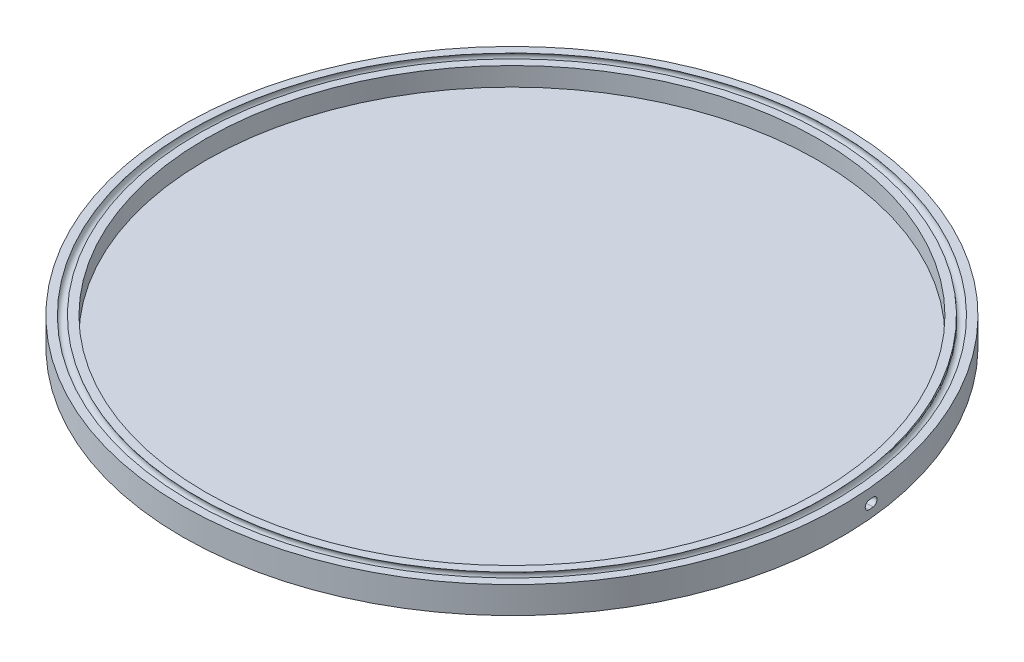
ISO-10303-21;
HEADER;
FILE_DESCRIPTION(('STEP AP214'),'2;1');
FILE_NAME('part.step','',(''),(''),'','','');
FILE_SCHEMA(('AUTOMOTIVE_DESIGN { 1 0 10303 214 1 1 1 1 }'));
ENDSEC;
DATA;
#1=APPLICATION_CONTEXT('core data for automotive mechanical design processes');
#2=APPLICATION_PROTOCOL_DEFINITION('international standard','automotive_design',2000,#1);
#3=PRODUCT_CONTEXT('',#1,'mechanical');
#4=PRODUCT('Part','Part','',(#3));
#5=PRODUCT_RELATED_PRODUCT_CATEGORY('part','',(#4));
#6=PRODUCT_DEFINITION_FORMATION('','',#4);
#7=PRODUCT_DEFINITION_CONTEXT('part definition',#1,'design');
#8=PRODUCT_DEFINITION('design','',#6,#7);
#9=PRODUCT_DEFINITION_SHAPE('','',#8);
#10=(LENGTH_UNIT() NAMED_UNIT(*) SI_UNIT(.MILLI.,.METRE.));
#11=(NAMED_UNIT(*) PLANE_ANGLE_UNIT() SI_UNIT($,.RADIAN.));
#12=(NAMED_UNIT(*) SI_UNIT($,.STERADIAN.) SOLID_ANGLE_UNIT());
#13=UNCERTAINTY_MEASURE_WITH_UNIT(LENGTH_MEASURE(1.E-05),#10,'distance_accuracy_value','');
#14=(GEOMETRIC_REPRESENTATION_CONTEXT(3) GLOBAL_UNCERTAINTY_ASSIGNED_CONTEXT((#13)) GLOBAL_UNIT_ASSIGNED_CONTEXT((#10,
#11,#12)) REPRESENTATION_CONTEXT('',''));
#15=CARTESIAN_POINT('',(0.,0.,0.));
#16=DIRECTION('',(0.,0.,1.));
#17=DIRECTION('',(1.,0.,0.));
#18=AXIS2_PLACEMENT_3D('',#15,#16,#17);
#19=CARTESIAN_POINT('',(0.,3.5,0.));
#20=DIRECTION('',(0.,-1.,0.));
#21=DIRECTION('',(0.,0.,-1.));
#22=AXIS2_PLACEMENT_3D('',#19,#20,#21);
#23=CYLINDRICAL_SURFACE('',#22,141.);
#24=CARTESIAN_POINT('',(0.,11.5,0.));
#25=DIRECTION('',(0.,1.,0.));
#26=DIRECTION('',(0.,0.,1.));
#27=AXIS2_PLACEMENT_3D('',#24,#25,#26);
#28=CIRCLE('',#27,141.);
#29=CARTESIAN_POINT('',(0.,11.5,141.));
#30=VERTEX_POINT('',#29);
#31=EDGE_CURVE('E154',#30,#30,#28,.T.);
#32=ORIENTED_EDGE('',*,*,#31,.F.);
#33=EDGE_LOOP('',(#32));
#34=FACE_BOUND('',#33,.T.);
#35=CARTESIAN_POINT('',(0.,0.,0.));
#36=DIRECTION('',(0.,1.,0.));
#37=DIRECTION('',(0.,0.,1.));
#38=AXIS2_PLACEMENT_3D('',#35,#36,#37);
#39=CIRCLE('',#38,141.);
#40=CARTESIAN_POINT('',(0.,0.,141.));
#41=VERTEX_POINT('',#40);
#42=EDGE_CURVE('E156',#41,#41,#39,.T.);
#43=ORIENTED_EDGE('',*,*,#42,.T.);
#44=EDGE_LOOP('',(#43));
#45=FACE_BOUND('',#44,.T.);
#46=CARTESIAN_POINT('',(140.460076297276,7.19911252835168,-12.3274882503872));
#47=CARTESIAN_POINT('',(140.464504219849,7.1991121939025,-12.2770380065143));
#48=CARTESIAN_POINT('',(140.468902500068,7.19697393469935,-12.2266095273074));
#49=CARTESIAN_POINT('',(140.477613960157,7.18844365782485,-12.1261087781533));
#50=CARTESIAN_POINT('',(140.481927144143,7.18205184647983,-12.0760364910473));
#51=CARTESIAN_POINT('',(140.494687345825,7.15655613458188,-11.9269747318822));
#52=CARTESIAN_POINT('',(140.502969347936,7.13113179269221,-11.8289769157106));
#53=CARTESIAN_POINT('',(140.518866432862,7.06413549298197,-11.6386138089124));
#54=CARTESIAN_POINT('',(140.526481206324,7.02255609310618,-11.5462511369162));
#55=CARTESIAN_POINT('',(140.540868975061,6.92443562570413,-11.3697839055409));
#56=CARTESIAN_POINT('',(140.547642133793,6.86789747015122,-11.2856777432577));
#57=CARTESIAN_POINT('',(140.560206165398,6.74145522149128,-11.1281042803489));
#58=CARTESIAN_POINT('',(140.565996946268,6.67154987779346,-11.0546379762851));
#59=CARTESIAN_POINT('',(140.576487278175,6.52034812763785,-10.9204288976374));
#60=CARTESIAN_POINT('',(140.581186663428,6.43904999360383,-10.859688056205));
#61=CARTESIAN_POINT('',(140.589412066087,6.26738416275859,-10.7526790072301));
#62=CARTESIAN_POINT('',(140.592938163379,6.17701708397538,-10.7064098143611));
#63=CARTESIAN_POINT('',(140.598761838329,5.98978002040423,-10.6296594151257));
#64=CARTESIAN_POINT('',(140.601059495683,5.89291045793057,-10.5991771845681));
#65=CARTESIAN_POINT('',(140.604392689533,5.6954276206218,-10.5548687950184));
#66=CARTESIAN_POINT('',(140.605428404095,5.5948148760308,-10.5410402861185));
#67=CARTESIAN_POINT('',(140.606223762925,5.39268710564919,-10.5304258591483));
#68=CARTESIAN_POINT('',(140.605983378993,5.29117205996836,-10.5336403177059));
#69=CARTESIAN_POINT('',(140.604229936011,5.09013801487735,-10.5570194000663));
#70=CARTESIAN_POINT('',(140.602717047373,4.99061875001985,-10.5771817542119));
#71=CARTESIAN_POINT('',(140.598440344632,4.79638721711288,-10.6338786013864));
#72=CARTESIAN_POINT('',(140.595676534119,4.7016749352668,-10.6704130474225));
#73=CARTESIAN_POINT('',(140.588939184721,4.51973658010567,-10.7588165945028));
#74=CARTESIAN_POINT('',(140.584965540616,4.43251115877252,-10.8106870293137));
#75=CARTESIAN_POINT('',(140.575873199012,4.26803434434799,-10.9282816501502));
#76=CARTESIAN_POINT('',(140.570754556648,4.19078247127681,-10.9940051690912));
#77=CARTESIAN_POINT('',(140.559462971532,4.04843609929217,-11.137438357207));
#78=CARTESIAN_POINT('',(140.553289988425,3.98334206592499,-11.2151484851633));
#79=CARTESIAN_POINT('',(140.540008150332,3.86714257603709,-11.3803763254523));
#80=CARTESIAN_POINT('',(140.532898998063,3.81604157898409,-11.4678971518806));
#81=CARTESIAN_POINT('',(140.517897192145,3.72927716106065,-11.6502766699078));
#82=CARTESIAN_POINT('',(140.510003997248,3.69362449698867,-11.7451404204442));
#83=CARTESIAN_POINT('',(140.493630829047,3.63886130970658,-11.9393949251941));
#84=CARTESIAN_POINT('',(140.485151773648,3.61972551588795,-12.0387785179525));
#85=CARTESIAN_POINT('',(140.473790257584,3.60576368451033,-12.1702610780117));
#86=CARTESIAN_POINT('',(140.471064313208,3.60326819057887,-12.2016840367135));
#87=CARTESIAN_POINT('',(140.465588212873,3.5999448890216,-12.2645634781718));
#88=CARTESIAN_POINT('',(140.462838104388,3.59911433135304,-12.2960198196381));
#89=CARTESIAN_POINT('',(140.460076297276,3.59911252835168,-12.3274882503872));
#90=B_SPLINE_CURVE_WITH_KNOTS('',3,(#46,#47,#48,#49,#50,#51,#52,#53,#54,#55,#56,#57,#58,#59,#60,
#61,#62,#63,#64,#65,#66,#67,#68,#69,#70,#71,#72,#73,#74,#75,#76,#77,#78,#79,#80,#81,#82,#83,#84,
#85,#86,#87,#88,#89),.UNSPECIFIED.,.F.,.F.,(4,2,2,2,2,2,2,2,2,2,2,2,2,2,2,2,2,2,2,2,2,4),(0.,
0.15183921682167,0.303671068941075,0.606848817720967,0.910166395512895,1.21342497082593,
1.51671193192177,1.82004493261221,2.12335727586613,2.426649939035,2.72989980136017,
3.03315636514896,3.33637232337682,3.63958741128995,3.94282887749671,4.24605574467918,
4.54929422060267,4.85262922400579,5.15617510391297,5.45925573492383,5.55414372768515,
5.6488748605307),.UNSPECIFIED.);
#91=CARTESIAN_POINT('',(140.460076297276,7.19911252835167,-12.3274882503872));
#92=VERTEX_POINT('',#91);
#93=CARTESIAN_POINT('',(140.460076297276,3.59911252835168,-12.3274882503872));
#94=VERTEX_POINT('',#93);
#95=EDGE_CURVE('E102',#92,#94,#90,.T.);
#96=ORIENTED_EDGE('',*,*,#95,.F.);
#97=CARTESIAN_POINT('',(0.,7.19911252835168,0.));
#98=DIRECTION('',(0.,-1.,0.));
#99=DIRECTION('',(0.,0.,-1.));
#100=AXIS2_PLACEMENT_3D('',#97,#98,#99);
#101=CIRCLE('',#100,141.);
#102=CARTESIAN_POINT('',(140.271092623964,7.19911252835168,-14.3185395232633));
#103=VERTEX_POINT('',#102);
#104=EDGE_CURVE('E100',#103,#92,#101,.T.);
#105=ORIENTED_EDGE('',*,*,#104,.F.);
#106=CARTESIAN_POINT('',(140.271092623964,3.59911252835168,-14.3185395232633));
#107=CARTESIAN_POINT('',(140.265949862683,3.59911286280086,-14.3689219171281));
#108=CARTESIAN_POINT('',(140.260782083147,3.60125112200401,-14.4192773581318));
#109=CARTESIAN_POINT('',(140.250429959928,3.60978139887851,-14.5196223812384));
#110=CARTESIAN_POINT('',(140.24524561706,3.61617321022353,-14.5696119809682));
#111=CARTESIAN_POINT('',(140.229733759625,3.64166892212148,-14.7184125625238));
#112=CARTESIAN_POINT('',(140.219430744472,3.66709326401115,-14.8162185511551));
#113=CARTESIAN_POINT('',(140.199229396931,3.73408956372139,-15.0061731122915));
#114=CARTESIAN_POINT('',(140.189331253379,3.77566896359718,-15.0983190547273));
#115=CARTESIAN_POINT('',(140.170261885618,3.87378943099923,-15.274341924979));
#116=CARTESIAN_POINT('',(140.16109052038,3.93032758655214,-15.358220457828));
#117=CARTESIAN_POINT('',(140.14378462026,4.05676983521208,-15.5153438390426));
#118=CARTESIAN_POINT('',(140.135650182509,4.1266751789099,-15.5885876913331));
#119=CARTESIAN_POINT('',(140.120703344273,4.27787692906551,-15.7223737738743));
#120=CARTESIAN_POINT('',(140.113891144664,4.35917506309954,-15.7829140743044));
#121=CARTESIAN_POINT('',(140.101837184636,4.53084089394477,-15.8895597299076));
#122=CARTESIAN_POINT('',(140.096595317299,4.62120797272798,-15.9356660678416));
#123=CARTESIAN_POINT('',(140.087875322827,4.80844503629913,-16.0121415584848));
#124=CARTESIAN_POINT('',(140.084397081275,4.90531459877279,-16.0425117320897));
#125=CARTESIAN_POINT('',(140.079334657047,5.10279743608156,-16.0866559890963));
#126=CARTESIAN_POINT('',(140.07775020715,5.20341018067256,-16.1004324139435));
#127=CARTESIAN_POINT('',(140.076534384893,5.40553795105418,-16.1110069319852));
#128=CARTESIAN_POINT('',(140.076903055696,5.507052996735,-16.107804649972));
#129=CARTESIAN_POINT('',(140.079579420611,5.70808704182601,-16.0845131681568));
#130=CARTESIAN_POINT('',(140.081886855085,5.80760630668351,-16.0644262295431));
#131=CARTESIAN_POINT('',(140.088353359827,6.00183783959048,-16.0079372307709));
#132=CARTESIAN_POINT('',(140.092512424781,6.09655012143656,-15.9715352174416));
#133=CARTESIAN_POINT('',(140.102527461665,6.2784884765977,-15.8834427770765));
#134=CARTESIAN_POINT('',(140.108383581188,6.36571389793084,-15.8317510202958));
#135=CARTESIAN_POINT('',(140.121577632848,6.53019071235537,-15.7145457195353));
#136=CARTESIAN_POINT('',(140.128915493632,6.60744258542655,-15.6490328411009));
#137=CARTESIAN_POINT('',(140.144810793322,6.74978895741119,-15.5060366215871));
#138=CARTESIAN_POINT('',(140.153368278908,6.81488299077837,-15.4285528223264));
#139=CARTESIAN_POINT('',(140.171409270661,6.93108248066628,-15.2637767043777));
#140=CARTESIAN_POINT('',(140.180893070734,6.98218347771927,-15.1764812712734));
#141=CARTESIAN_POINT('',(140.200471692759,7.06894789564271,-14.9945361687391));
#142=CARTESIAN_POINT('',(140.210566934907,7.10460055971469,-14.8998814288816));
#143=CARTESIAN_POINT('',(140.231032820973,7.15936374699678,-14.7060153907003));
#144=CARTESIAN_POINT('',(140.241403019063,7.17849954081541,-14.6068112986395));
#145=CARTESIAN_POINT('',(140.254981268234,7.19246137219303,-14.4755391431899));
#146=CARTESIAN_POINT('',(140.25821585766,7.19495686612449,-14.44416446331));
#147=CARTESIAN_POINT('',(140.264667564438,7.19828016768175,-14.3813776230276));
#148=CARTESIAN_POINT('',(140.267884701834,7.19911072535031,-14.3499656103239));
#149=CARTESIAN_POINT('',(140.271092623964,7.19911252835168,-14.3185395232633));
#150=B_SPLINE_CURVE_WITH_KNOTS('',3,(#106,#107,#108,#109,#110,#111,#112,#113,#114,#115,#116,
#117,#118,#119,#120,#121,#122,#123,#124,#125,#126,#127,#128,#129,#130,#131,#132,#133,#134,#135,
#136,#137,#138,#139,#140,#141,#142,#143,#144,#145,#146,#147,#148,#149),.UNSPECIFIED.,.F.,.F.,(4,
2,2,2,2,2,2,2,2,2,2,2,2,2,2,2,2,2,2,2,2,4),(0.,0.151839216821674,0.303671068941078,
0.60684881772097,0.910166395512894,1.21342497082593,1.51671193192177,1.82004493261221,
2.12335727586613,2.426649939035,2.72989980136017,3.03315636514896,3.33637232337682,
3.63958741128994,3.94282887749671,4.24605574467918,4.54929422060267,4.85262922400579,
5.15617510391298,5.45925573492384,5.55414372768515,5.64887486053069),.UNSPECIFIED.);
#151=CARTESIAN_POINT('',(140.271092623964,3.59911252835168,-14.3185395232633));
#152=VERTEX_POINT('',#151);
#153=EDGE_CURVE('E87',#152,#103,#150,.T.);
#154=ORIENTED_EDGE('',*,*,#153,.F.);
#155=CARTESIAN_POINT('',(0.,3.59911252835168,0.));
#156=DIRECTION('',(0.,-1.,0.));
#157=DIRECTION('',(0.,0.,-1.));
#158=AXIS2_PLACEMENT_3D('',#155,#156,#157);
#159=CIRCLE('',#158,141.);
#160=EDGE_CURVE('E82',#152,#94,#159,.T.);
#161=ORIENTED_EDGE('',*,*,#160,.T.);
#162=EDGE_LOOP('',(#96,#105,#154,#161));
#163=FACE_BOUND('',#162,.T.);
#164=ADVANCED_FACE('F33',(#34,#45,#163),#23,.T.);
#165=CARTESIAN_POINT('',(0.,11.5,0.));
#166=DIRECTION('',(0.,-1.,0.));
#167=DIRECTION('',(0.,0.,-1.));
#168=AXIS2_PLACEMENT_3D('',#165,#166,#167);
#169=CYLINDRICAL_SURFACE('',#168,131.);
#170=CARTESIAN_POINT('',(0.,11.5,0.));
#171=DIRECTION('',(0.,1.,0.));
#172=DIRECTION('',(0.,0.,1.));
#173=AXIS2_PLACEMENT_3D('',#170,#171,#172);
#174=CIRCLE('',#173,131.);
#175=CARTESIAN_POINT('',(0.,11.5,131.));
#176=VERTEX_POINT('',#175);
#177=EDGE_CURVE('E162',#176,#176,#174,.T.);
#178=ORIENTED_EDGE('',*,*,#177,.T.);
#179=EDGE_LOOP('',(#178));
#180=FACE_BOUND('',#179,.T.);
#181=CARTESIAN_POINT('',(0.,3.5,0.));
#182=DIRECTION('',(0.,1.,0.));
#183=DIRECTION('',(0.,0.,1.));
#184=AXIS2_PLACEMENT_3D('',#181,#182,#183);
#185=CIRCLE('',#184,131.);
#186=CARTESIAN_POINT('',(0.,3.5,131.));
#187=VERTEX_POINT('',#186);
#188=EDGE_CURVE('E157',#187,#187,#185,.F.);
#189=ORIENTED_EDGE('',*,*,#188,.T.);
#190=EDGE_LOOP('',(#189));
#191=FACE_BOUND('',#190,.T.);
#192=CARTESIAN_POINT('',(0.,7.19911252835168,0.));
#193=DIRECTION('',(0.,-1.,0.));
#194=DIRECTION('',(0.,0.,-1.));
#195=AXIS2_PLACEMENT_3D('',#192,#193,#194);
#196=CIRCLE('',#195,131.);
#197=CARTESIAN_POINT('',(130.315566765205,7.19911252835168,-13.3735955772342));
#198=VERTEX_POINT('',#197);
#199=CARTESIAN_POINT('',(130.504550438517,7.19911252835167,-11.3825443043581));
#200=VERTEX_POINT('',#199);
#201=EDGE_CURVE('E46',#198,#200,#196,.T.);
#202=ORIENTED_EDGE('',*,*,#201,.T.);
#203=CARTESIAN_POINT('',(130.504550438517,7.19911252835168,-11.3825443043581));
#204=CARTESIAN_POINT('',(130.508951099036,7.19911219418529,-11.3320912023996));
#205=CARTESIAN_POINT('',(130.513320027412,7.19697391205854,-11.2816596995613));
#206=CARTESIAN_POINT('',(130.521968895699,7.18844356121873,-11.1811526094153));
#207=CARTESIAN_POINT('',(130.526248839924,7.18205169925417,-11.1310770049285));
#208=CARTESIAN_POINT('',(130.53890403171,7.1565558310861,-10.9820049639636));
#209=CARTESIAN_POINT('',(130.547108889265,7.13113137895031,-10.8839997833657));
#210=CARTESIAN_POINT('',(130.562841648491,7.06413497541499,-10.6936212671119));
#211=CARTESIAN_POINT('',(130.57036923652,7.02255558962006,-10.6012505470747));
#212=CARTESIAN_POINT('',(130.584578243211,6.924435280323,-10.4247668340415));
#213=CARTESIAN_POINT('',(130.59125982594,6.86789726436823,-10.3406522406322));
#214=CARTESIAN_POINT('',(130.603642861993,6.74145461848529,-10.1830611135525));
#215=CARTESIAN_POINT('',(130.609344212383,6.67154858641605,-10.1095856972232));
#216=CARTESIAN_POINT('',(130.619664478974,6.52034510239195,-9.97535936457744));
#217=CARTESIAN_POINT('',(130.624283230811,6.43904592369034,-9.9146103805692));
#218=CARTESIAN_POINT('',(130.632362490999,6.26737788894252,-9.80758691554636));
#219=CARTESIAN_POINT('',(130.635823082599,6.17700968538029,-9.7613113942025));
#220=CARTESIAN_POINT('',(130.641536159235,5.98977001317032,-9.68455057254325));
#221=CARTESIAN_POINT('',(130.643788722817,5.89289896779139,-9.65406424563556));
#222=CARTESIAN_POINT('',(130.64705578322,5.69541550008219,-9.60975098708103));
#223=CARTESIAN_POINT('',(130.648070486415,5.59480370428655,-9.59592127847564));
#224=CARTESIAN_POINT('',(130.64884969807,5.39267789682106,-9.58530657896024));
#225=CARTESIAN_POINT('',(130.64861417908,5.29116386539086,-9.58852196228688));
#226=CARTESIAN_POINT('',(130.646895953757,5.09013398653374,-9.6119047106223));
#227=CARTESIAN_POINT('',(130.64541343894,4.99061783467226,-9.63206947251941));
#228=CARTESIAN_POINT('',(130.64122050404,4.79639245515738,-9.68877219548038));
#229=CARTESIAN_POINT('',(130.638510087422,4.70168321393796,-9.72531011033322));
#230=CARTESIAN_POINT('',(130.631898185159,4.51974972652196,-9.81372162301147));
#231=CARTESIAN_POINT('',(130.627996584441,4.43252620451476,-9.86559670244399));
#232=CARTESIAN_POINT('',(130.619061255198,4.26805268187523,-9.98320099791563));
#233=CARTESIAN_POINT('',(130.614027580989,4.19080220303256,-10.0489295492785));
#234=CARTESIAN_POINT('',(130.602912147646,4.04845583530984,-10.192374727018));
#235=CARTESIAN_POINT('',(130.596830319734,3.98336074463235,-10.2700921400504));
#236=CARTESIAN_POINT('',(130.583730403924,3.86715885891508,-10.4353346864352));
#237=CARTESIAN_POINT('',(130.576712018546,3.81605652421122,-10.5228629345918));
#238=CARTESIAN_POINT('',(130.561885029561,3.72928854044845,-10.705258314141));
#239=CARTESIAN_POINT('',(130.554075869183,3.69363386238027,-10.800130605125));
#240=CARTESIAN_POINT('',(130.537858825299,3.63886694662514,-10.9944016821587));
#241=CARTESIAN_POINT('',(130.529451877827,3.61972943740374,-11.0937933073745));
#242=CARTESIAN_POINT('',(130.518174550673,3.6057653214242,-11.2252891388964));
#243=CARTESIAN_POINT('',(130.515467696153,3.6032692145062,-11.2567177687761));
#244=CARTESIAN_POINT('',(130.510028174254,3.59994509493073,-11.319608452019));
#245=CARTESIAN_POINT('',(130.507295556942,3.59911433155879,-11.3510703642429));
#246=CARTESIAN_POINT('',(130.504550438517,3.59911252835168,-11.3825443043581));
#247=B_SPLINE_CURVE_WITH_KNOTS('',3,(#203,#204,#205,#206,#207,#208,#209,#210,#211,#212,#213,
#214,#215,#216,#217,#218,#219,#220,#221,#222,#223,#224,#225,#226,#227,#228,#229,#230,#231,#232,
#233,#234,#235,#236,#237,#238,#239,#240,#241,#242,#243,#244,#245,#246),.UNSPECIFIED.,.F.,.F.,(4,
2,2,2,2,2,2,2,2,2,2,2,2,2,2,2,2,2,2,2,2,4),(0.,0.151840625554291,0.303673871318206,
0.606854221532497,0.910174258943357,1.21343538251743,1.51672833193084,1.82006729827629,
2.12338445609041,2.42668189015184,2.72992875206064,3.03318227198937,3.33638922628358,
3.63959532482233,3.94283072337746,4.24605157630152,4.54929233370014,4.8526296400025,
5.1561820259982,5.45926914441482,5.55416924884038,5.64891247338579),.UNSPECIFIED.);
#248=CARTESIAN_POINT('',(130.504550438517,3.59911252835168,-11.3825443043581));
#249=VERTEX_POINT('',#248);
#250=EDGE_CURVE('E11',#200,#249,#247,.T.);
#251=ORIENTED_EDGE('',*,*,#250,.T.);
#252=CARTESIAN_POINT('',(0.,3.59911252835168,0.));
#253=DIRECTION('',(0.,-1.,0.));
#254=DIRECTION('',(0.,0.,-1.));
#255=AXIS2_PLACEMENT_3D('',#252,#253,#254);
#256=CIRCLE('',#255,131.);
#257=CARTESIAN_POINT('',(130.315566765205,3.59911252835168,-13.3735955772342));
#258=VERTEX_POINT('',#257);
#259=EDGE_CURVE('E121',#258,#249,#256,.T.);
#260=ORIENTED_EDGE('',*,*,#259,.F.);
#261=CARTESIAN_POINT('',(130.315566765205,3.59911252835168,-13.3735955772342));
#262=CARTESIAN_POINT('',(130.310396690985,3.59911286251806,-13.4239756491158));
#263=CARTESIAN_POINT('',(130.305199514895,3.60125114464482,-13.4743285375571));
#264=CARTESIAN_POINT('',(130.294784724619,3.60978149548463,-13.5746680125196));
#265=CARTESIAN_POINT('',(130.289567111439,3.61617335744918,-13.6246546167251));
#266=CARTESIAN_POINT('',(130.273950184916,3.64166922561726,-13.7734455401128));
#267=CARTESIAN_POINT('',(130.263570017281,3.66709367775305,-13.8712442478312));
#268=CARTESIAN_POINT('',(130.243204379367,3.73409008128837,-14.0611830273267));
#269=CARTESIAN_POINT('',(130.233219093145,3.7756694670833,-14.1533204711852));
#270=CARTESIAN_POINT('',(130.213971054737,3.87378977638036,-14.3293258968248));
#271=CARTESIAN_POINT('',(130.204708162591,3.93032779233512,-14.4131954813072));
#272=CARTESIAN_POINT('',(130.187221175728,4.05677043821807,-14.5703021590984));
#273=CARTESIAN_POINT('',(130.17899719013,4.12667647028731,-14.6435381356533));
#274=CARTESIAN_POINT('',(130.163880077371,4.27787995431141,-14.7773091683167));
#275=CARTESIAN_POINT('',(130.156987152321,4.35917913301302,-14.8378422957002));
#276=CARTESIAN_POINT('',(130.144786947341,4.53084716776084,-14.9444746149526));
#277=CARTESIAN_POINT('',(130.139479553447,4.62121537132306,-14.9905748442352));
#278=CARTESIAN_POINT('',(130.130648974806,4.80845504353304,-15.0670397634291));
#279=CARTESIAN_POINT('',(130.127125674061,4.90532608891196,-15.0974054763776));
#280=CARTESIAN_POINT('',(130.121997381313,5.10280955662117,-15.1415420732207));
#281=CARTESIAN_POINT('',(130.120392069547,5.20342135241681,-15.1553157233113));
#282=CARTESIAN_POINT('',(130.119160337186,5.4055471598823,-15.1658874711325));
#283=CARTESIAN_POINT('',(130.119533960039,5.50706119131249,-15.162685196145));
#284=CARTESIAN_POINT('',(130.122245603428,5.70809107016961,-15.139396739603));
#285=CARTESIAN_POINT('',(130.124583322314,5.80760722203109,-15.1193131507066));
#286=CARTESIAN_POINT('',(130.131133204479,6.00183260154598,-15.062834140996));
#287=CARTESIAN_POINT('',(130.135345362468,6.0965418427654,-15.0264387662197));
#288=CARTESIAN_POINT('',(130.145485104959,6.2784753301814,-14.9383621038862));
#289=CARTESIAN_POINT('',(130.15141285519,6.3656988521886,-14.8866793395301));
#290=CARTESIAN_POINT('',(130.164762935544,6.53017237482813,-14.7694940769046));
#291=CARTESIAN_POINT('',(130.172185193961,6.6074228536708,-14.7039922416608));
#292=CARTESIAN_POINT('',(130.188255755513,6.74976922139352,-14.5610173874853));
#293=CARTESIAN_POINT('',(130.196904139099,6.81486431207101,-14.4835435830056));
#294=CARTESIAN_POINT('',(130.21512657125,6.93106619778828,-14.3187872480851));
#295=CARTESIAN_POINT('',(130.224700913662,6.98216853249213,-14.2315016024951));
#296=CARTESIAN_POINT('',(130.244454214997,7.06893651625491,-14.0495738114087));
#297=CARTESIAN_POINT('',(130.254633597808,7.10459119432309,-13.9549264937077));
#298=CARTESIAN_POINT('',(130.275255938093,7.15935811007822,-13.761073552112));
#299=CARTESIAN_POINT('',(130.28569846766,7.17849561929961,-13.6618751372806));
#300=CARTESIAN_POINT('',(130.299361899212,7.19245973527916,-13.5306057865028));
#301=CARTESIAN_POINT('',(130.302616304564,7.19495584219716,-13.4992291282469));
#302=CARTESIAN_POINT('',(130.309106051589,7.19827996177263,-13.4364381287262));
#303=CARTESIAN_POINT('',(130.312341415883,7.19911072514456,-13.4050239355003));
#304=CARTESIAN_POINT('',(130.315566765205,7.19911252835168,-13.3735955772342));
#305=B_SPLINE_CURVE_WITH_KNOTS('',3,(#261,#262,#263,#264,#265,#266,#267,#268,#269,#270,#271,
#272,#273,#274,#275,#276,#277,#278,#279,#280,#281,#282,#283,#284,#285,#286,#287,#288,#289,#290,
#291,#292,#293,#294,#295,#296,#297,#298,#299,#300,#301,#302,#303,#304),.UNSPECIFIED.,.F.,.F.,(4,
2,2,2,2,2,2,2,2,2,2,2,2,2,2,2,2,2,2,2,2,4),(0.,0.151840625554292,0.303673871318207,
0.606854221532495,0.910174258943354,1.21343538251743,1.51672833193084,1.82006729827629,
2.12338445609041,2.42668189015184,2.72992875206063,3.03318227198937,3.33638922628357,
3.63959532482232,3.94283072337745,4.24605157630152,4.54929233370014,4.8526296400025,
5.1561820259982,5.45926914441482,5.55416924884038,5.64891247338579),.UNSPECIFIED.);
#306=EDGE_CURVE('E95',#258,#198,#305,.T.);
#307=ORIENTED_EDGE('',*,*,#306,.T.);
#308=EDGE_LOOP('',(#202,#251,#260,#307));
#309=FACE_BOUND('',#308,.T.);
#310=ADVANCED_FACE('F123',(#180,#191,#309),#169,.F.);
#311=CARTESIAN_POINT('',(0.,11.5,0.));
#312=DIRECTION('',(0.,1.,0.));
#313=DIRECTION('',(0.,0.,1.));
#314=AXIS2_PLACEMENT_3D('',#311,#312,#313);
#315=PLANE('',#314);
#316=ORIENTED_EDGE('',*,*,#31,.T.);
#317=EDGE_LOOP('',(#316));
#318=FACE_BOUND('',#317,.T.);
#319=CARTESIAN_POINT('',(0.,11.5,0.));
#320=DIRECTION('',(0.,1.,0.));
#321=DIRECTION('',(0.,0.,1.));
#322=AXIS2_PLACEMENT_3D('',#319,#320,#321);
#323=CIRCLE('',#322,137.519868415357);
#324=CARTESIAN_POINT('',(136.904554527077,11.5,-12.9945049432369));
#325=VERTEX_POINT('',#324);
#326=EDGE_CURVE('E167',#325,#325,#323,.F.);
#327=ORIENTED_EDGE('',*,*,#326,.T.);
#328=EDGE_LOOP('',(#327));
#329=FACE_BOUND('',#328,.T.);
#330=ADVANCED_FACE('F128',(#318,#329),#315,.T.);
#331=CARTESIAN_POINT('',(0.,0.,0.));
#332=DIRECTION('',(0.,1.,0.));
#333=DIRECTION('',(0.,0.,1.));
#334=AXIS2_PLACEMENT_3D('',#331,#332,#333);
#335=PLANE('',#334);
#336=ORIENTED_EDGE('',*,*,#42,.F.);
#337=EDGE_LOOP('',(#336));
#338=FACE_BOUND('',#337,.T.);
#339=ADVANCED_FACE('F134',(#338),#335,.F.);
#340=CARTESIAN_POINT('',(0.,10.2,0.));
#341=DIRECTION('',(0.,1.,0.));
#342=DIRECTION('',(0.,0.,1.));
#343=AXIS2_PLACEMENT_3D('',#340,#341,#342);
#344=TOROIDAL_SURFACE('',#343,136.,2.00000000000002);
#345=CARTESIAN_POINT('',(135.391486555576,10.2,-12.8508897851946));
#346=DIRECTION('',(0.0944918366558428,0.,0.995525636438061));
#347=DIRECTION('',(0.995525636438061,0.,-0.0944918366558428));
#348=AXIS2_PLACEMENT_3D('',#345,#346,#347);
#349=CIRCLE('',#348,2.00000000000002);
#350=CARTESIAN_POINT('',(133.878418584076,11.5,-12.7072746271523));
#351=VERTEX_POINT('',#350);
#352=EDGE_CURVE('E180',#351,#325,#349,.T.);
#353=ORIENTED_EDGE('',*,*,#352,.F.);
#354=CARTESIAN_POINT('',(0.,11.5,0.));
#355=DIRECTION('',(0.,-1.,0.));
#356=DIRECTION('',(0.,0.,-1.));
#357=AXIS2_PLACEMENT_3D('',#354,#355,#356);
#358=CIRCLE('',#357,134.480131584643);
#359=EDGE_CURVE('E160',#351,#351,#358,.F.);
#360=ORIENTED_EDGE('',*,*,#359,.F.);
#361=ORIENTED_EDGE('',*,*,#352,.T.);
#362=ORIENTED_EDGE('',*,*,#326,.F.);
#363=EDGE_LOOP('',(#353,#360,#361,#362));
#364=FACE_BOUND('',#363,.T.);
#365=ADVANCED_FACE('F130',(#364),#344,.F.);
#366=CARTESIAN_POINT('',(0.,3.5,0.));
#367=DIRECTION('',(0.,1.,0.));
#368=DIRECTION('',(0.,0.,1.));
#369=AXIS2_PLACEMENT_3D('',#366,#367,#368);
#370=PLANE('',#369);
#371=ORIENTED_EDGE('',*,*,#188,.F.);
#372=EDGE_LOOP('',(#371));
#373=FACE_BOUND('',#372,.T.);
#374=ADVANCED_FACE('F137',(#373),#370,.T.);
#375=ORIENTED_EDGE('',*,*,#177,.F.);
#376=EDGE_LOOP('',(#375));
#377=FACE_BOUND('',#376,.T.);
#378=ORIENTED_EDGE('',*,*,#359,.T.);
#379=EDGE_LOOP('',(#378));
#380=FACE_BOUND('',#379,.T.);
#381=ADVANCED_FACE('F136',(#377,#380),#315,.T.);
#382=CARTESIAN_POINT('',(125.530722027852,5.39911252835168,-10.9104457821981));
#383=DIRECTION('',(0.995525636438061,0.,-0.0944918366558428));
#384=DIRECTION('',(-0.0944918366558428,0.,-0.995525636438061));
#385=AXIS2_PLACEMENT_3D('',#382,#383,#384);
#386=CYLINDRICAL_SURFACE('',#385,1.8);
#387=ORIENTED_EDGE('',*,*,#95,.T.);
#388=DIRECTION('',(0.995525636438061,0.,-0.0944918366558428));
#389=VECTOR('',#388,1.);
#390=CARTESIAN_POINT('',(125.530722027852,3.59911252835168,-10.9104457821981));
#391=LINE('',#390,#389);
#392=EDGE_CURVE('E53',#249,#94,#391,.T.);
#393=ORIENTED_EDGE('',*,*,#392,.F.);
#394=ORIENTED_EDGE('',*,*,#250,.F.);
#395=DIRECTION('',(0.995525636438061,0.,-0.0944918366558428));
#396=VECTOR('',#395,1.);
#397=CARTESIAN_POINT('',(125.530722027852,7.19911252835167,-10.9104457821981));
#398=LINE('',#397,#396);
#399=EDGE_CURVE('E88',#200,#92,#398,.T.);
#400=ORIENTED_EDGE('',*,*,#399,.T.);
#401=EDGE_LOOP('',(#387,#393,#394,#400));
#402=FACE_BOUND('',#401,.T.);
#403=ADVANCED_FACE('F173',(#402),#386,.F.);
#404=CARTESIAN_POINT('',(125.530722027852,7.19911252835167,-10.9104457821981));
#405=DIRECTION('',(0.,-1.,0.));
#406=DIRECTION('',(0.,0.,-1.));
#407=AXIS2_PLACEMENT_3D('',#404,#405,#406);
#408=PLANE('',#407);
#409=ORIENTED_EDGE('',*,*,#104,.T.);
#410=ORIENTED_EDGE('',*,*,#399,.F.);
#411=ORIENTED_EDGE('',*,*,#201,.F.);
#412=DIRECTION('',(0.995525636438061,0.,-0.0944918366558428));
#413=VECTOR('',#412,1.);
#414=CARTESIAN_POINT('',(125.34173835454,7.19911252835168,-12.9014970550743));
#415=LINE('',#414,#413);
#416=EDGE_CURVE('E97',#198,#103,#415,.T.);
#417=ORIENTED_EDGE('',*,*,#416,.T.);
#418=EDGE_LOOP('',(#409,#410,#411,#417));
#419=FACE_BOUND('',#418,.T.);
#420=ADVANCED_FACE('F114',(#419),#408,.T.);
#421=CARTESIAN_POINT('',(125.34173835454,5.39911252835168,-12.9014970550743));
#422=DIRECTION('',(0.995525636438061,0.,-0.0944918366558428));
#423=DIRECTION('',(-0.0944918366558428,0.,-0.995525636438061));
#424=AXIS2_PLACEMENT_3D('',#421,#422,#423);
#425=CYLINDRICAL_SURFACE('',#424,1.8);
#426=ORIENTED_EDGE('',*,*,#153,.T.);
#427=ORIENTED_EDGE('',*,*,#416,.F.);
#428=ORIENTED_EDGE('',*,*,#306,.F.);
#429=DIRECTION('',(0.995525636438061,0.,-0.0944918366558428));
#430=VECTOR('',#429,1.);
#431=CARTESIAN_POINT('',(125.34173835454,3.59911252835168,-12.9014970550743));
#432=LINE('',#431,#430);
#433=EDGE_CURVE('E58',#258,#152,#432,.T.);
#434=ORIENTED_EDGE('',*,*,#433,.T.);
#435=EDGE_LOOP('',(#426,#427,#428,#434));
#436=FACE_BOUND('',#435,.T.);
#437=ADVANCED_FACE('F91',(#436),#425,.F.);
#438=CARTESIAN_POINT('',(125.530722027852,3.59911252835168,-10.9104457821981));
#439=DIRECTION('',(0.,-1.,0.));
#440=DIRECTION('',(0.,0.,-1.));
#441=AXIS2_PLACEMENT_3D('',#438,#439,#440);
#442=PLANE('',#441);
#443=ORIENTED_EDGE('',*,*,#433,.F.);
#444=ORIENTED_EDGE('',*,*,#259,.T.);
#445=ORIENTED_EDGE('',*,*,#392,.T.);
#446=ORIENTED_EDGE('',*,*,#160,.F.);
#447=EDGE_LOOP('',(#443,#444,#445,#446));
#448=FACE_BOUND('',#447,.T.);
#449=ADVANCED_FACE('F83',(#448),#442,.F.);
#450=CLOSED_SHELL('',(#164,#310,#330,#339,#365,#374,#381,#403,#420,#437,#449));
#451=MANIFOLD_SOLID_BREP('B2',#450);
#452=ADVANCED_BREP_SHAPE_REPRESENTATION('',(#18,#451),#14);
#453=SHAPE_DEFINITION_REPRESENTATION(#9,#452);
ENDSEC;
END-ISO-10303-21;
